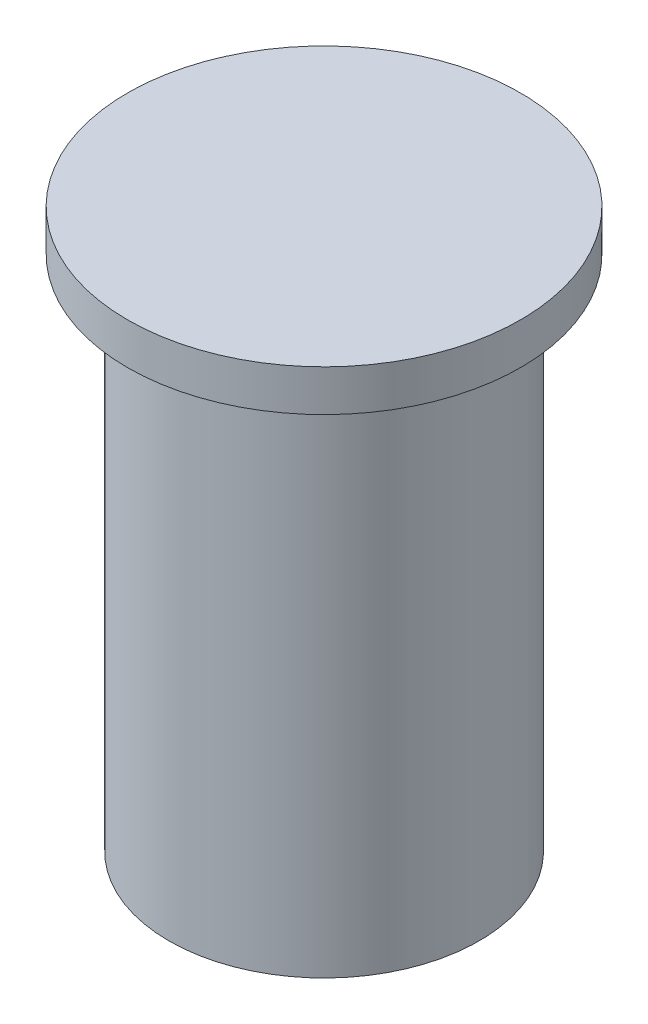
ISO-10303-21;
HEADER;
FILE_DESCRIPTION(('STEP AP214'),'2;1');
FILE_NAME('part.step','',(''),(''),'','','');
FILE_SCHEMA(('AUTOMOTIVE_DESIGN { 1 0 10303 214 1 1 1 1 }'));
ENDSEC;
DATA;
#1=APPLICATION_CONTEXT('core data for automotive mechanical design processes');
#2=APPLICATION_PROTOCOL_DEFINITION('international standard','automotive_design',2000,#1);
#3=PRODUCT_CONTEXT('',#1,'mechanical');
#4=PRODUCT('Part','Part','',(#3));
#5=PRODUCT_RELATED_PRODUCT_CATEGORY('part','',(#4));
#6=PRODUCT_DEFINITION_FORMATION('','',#4);
#7=PRODUCT_DEFINITION_CONTEXT('part definition',#1,'design');
#8=PRODUCT_DEFINITION('design','',#6,#7);
#9=PRODUCT_DEFINITION_SHAPE('','',#8);
#10=(LENGTH_UNIT() NAMED_UNIT(*) SI_UNIT(.MILLI.,.METRE.));
#11=(NAMED_UNIT(*) PLANE_ANGLE_UNIT() SI_UNIT($,.RADIAN.));
#12=(NAMED_UNIT(*) SI_UNIT($,.STERADIAN.) SOLID_ANGLE_UNIT());
#13=UNCERTAINTY_MEASURE_WITH_UNIT(LENGTH_MEASURE(1.E-05),#10,'distance_accuracy_value','');
#14=(GEOMETRIC_REPRESENTATION_CONTEXT(3) GLOBAL_UNCERTAINTY_ASSIGNED_CONTEXT((#13)) GLOBAL_UNIT_ASSIGNED_CONTEXT((#10,
#11,#12)) REPRESENTATION_CONTEXT('',''));
#15=CARTESIAN_POINT('',(0.,0.,0.));
#16=DIRECTION('',(0.,0.,1.));
#17=DIRECTION('',(1.,0.,0.));
#18=AXIS2_PLACEMENT_3D('',#15,#16,#17);
#19=CARTESIAN_POINT('',(0.,0.399999999999994,0.));
#20=DIRECTION('',(0.,1.,0.));
#21=DIRECTION('',(0.,0.,1.));
#22=AXIS2_PLACEMENT_3D('',#19,#20,#21);
#23=PLANE('',#22);
#24=CARTESIAN_POINT('',(0.,0.399999999999993,0.));
#25=DIRECTION('',(0.,1.,0.));
#26=DIRECTION('',(0.,0.,1.));
#27=AXIS2_PLACEMENT_3D('',#24,#25,#26);
#28=CIRCLE('',#27,1.9);
#29=CARTESIAN_POINT('',(0.,0.399999999999993,1.9));
#30=VERTEX_POINT('',#29);
#31=EDGE_CURVE('E10',#30,#30,#28,.T.);
#32=ORIENTED_EDGE('',*,*,#31,.T.);
#33=EDGE_LOOP('',(#32));
#34=FACE_BOUND('',#33,.T.);
#35=ADVANCED_FACE('F36',(#34),#23,.T.);
#36=CARTESIAN_POINT('',(0.,0.399999999999994,0.));
#37=DIRECTION('',(0.,1.,0.));
#38=DIRECTION('',(0.,0.,1.));
#39=AXIS2_PLACEMENT_3D('',#36,#37,#38);
#40=CYLINDRICAL_SURFACE('',#39,1.9);
#41=CARTESIAN_POINT('',(0.,0.,0.));
#42=DIRECTION('',(0.,1.,0.));
#43=DIRECTION('',(0.,0.,1.));
#44=AXIS2_PLACEMENT_3D('',#41,#42,#43);
#45=CIRCLE('',#44,1.9);
#46=CARTESIAN_POINT('',(0.,0.,1.9));
#47=VERTEX_POINT('',#46);
#48=EDGE_CURVE('E42',#47,#47,#45,.T.);
#49=ORIENTED_EDGE('',*,*,#48,.T.);
#50=EDGE_LOOP('',(#49));
#51=FACE_BOUND('',#50,.T.);
#52=ORIENTED_EDGE('',*,*,#31,.F.);
#53=EDGE_LOOP('',(#52));
#54=FACE_BOUND('',#53,.T.);
#55=ADVANCED_FACE('F68',(#51,#54),#40,.T.);
#56=CARTESIAN_POINT('',(0.,0.,0.));
#57=DIRECTION('',(0.,-1.,0.));
#58=DIRECTION('',(0.,0.,-1.));
#59=AXIS2_PLACEMENT_3D('',#56,#57,#58);
#60=PLANE('',#59);
#61=CARTESIAN_POINT('',(0.,0.,0.));
#62=DIRECTION('',(0.,1.,0.));
#63=DIRECTION('',(0.,0.,1.));
#64=AXIS2_PLACEMENT_3D('',#61,#62,#63);
#65=CIRCLE('',#64,1.5);
#66=CARTESIAN_POINT('',(0.,0.,1.5));
#67=VERTEX_POINT('',#66);
#68=EDGE_CURVE('E46',#67,#67,#65,.T.);
#69=ORIENTED_EDGE('',*,*,#68,.T.);
#70=EDGE_LOOP('',(#69));
#71=FACE_BOUND('',#70,.T.);
#72=ORIENTED_EDGE('',*,*,#48,.F.);
#73=EDGE_LOOP('',(#72));
#74=FACE_BOUND('',#73,.T.);
#75=ADVANCED_FACE('F65',(#71,#74),#60,.T.);
#76=CARTESIAN_POINT('',(0.,0.399999999999994,0.));
#77=DIRECTION('',(0.,1.,0.));
#78=DIRECTION('',(0.,0.,1.));
#79=AXIS2_PLACEMENT_3D('',#76,#77,#78);
#80=CYLINDRICAL_SURFACE('',#79,1.5);
#81=CARTESIAN_POINT('',(0.,-5.00000000000001,0.));
#82=DIRECTION('',(0.,1.,0.));
#83=DIRECTION('',(0.,0.,1.));
#84=AXIS2_PLACEMENT_3D('',#81,#82,#83);
#85=CIRCLE('',#84,1.5);
#86=CARTESIAN_POINT('',(0.,-5.00000000000001,1.5));
#87=VERTEX_POINT('',#86);
#88=EDGE_CURVE('E50',#87,#87,#85,.T.);
#89=ORIENTED_EDGE('',*,*,#88,.T.);
#90=EDGE_LOOP('',(#89));
#91=FACE_BOUND('',#90,.T.);
#92=ORIENTED_EDGE('',*,*,#68,.F.);
#93=EDGE_LOOP('',(#92));
#94=FACE_BOUND('',#93,.T.);
#95=ADVANCED_FACE('F56',(#91,#94),#80,.T.);
#96=CARTESIAN_POINT('',(0.,-5.00000000000001,0.));
#97=DIRECTION('',(0.,-1.,0.));
#98=DIRECTION('',(0.,0.,-1.));
#99=AXIS2_PLACEMENT_3D('',#96,#97,#98);
#100=PLANE('',#99);
#101=ORIENTED_EDGE('',*,*,#88,.F.);
#102=EDGE_LOOP('',(#101));
#103=FACE_BOUND('',#102,.T.);
#104=ADVANCED_FACE('F59',(#103),#100,.T.);
#105=CLOSED_SHELL('',(#35,#55,#75,#95,#104));
#106=MANIFOLD_SOLID_BREP('B2',#105);
#107=ADVANCED_BREP_SHAPE_REPRESENTATION('',(#18,#106),#14);
#108=SHAPE_DEFINITION_REPRESENTATION(#9,#107);
ENDSEC;
END-ISO-10303-21;
